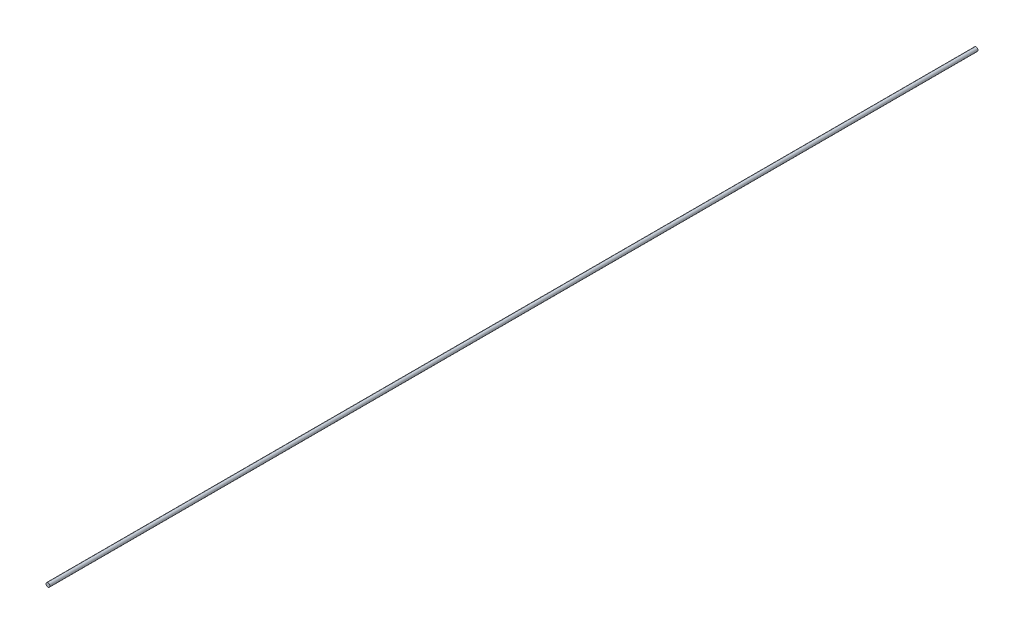
ISO-10303-21;
HEADER;
FILE_DESCRIPTION(('STEP AP214'),'2;1');
FILE_NAME('part.step','',(''),(''),'','','');
FILE_SCHEMA(('AUTOMOTIVE_DESIGN { 1 0 10303 214 1 1 1 1 }'));
ENDSEC;
DATA;
#1=APPLICATION_CONTEXT('core data for automotive mechanical design processes');
#2=APPLICATION_PROTOCOL_DEFINITION('international standard','automotive_design',2000,#1);
#3=PRODUCT_CONTEXT('',#1,'mechanical');
#4=PRODUCT('Part','Part','',(#3));
#5=PRODUCT_RELATED_PRODUCT_CATEGORY('part','',(#4));
#6=PRODUCT_DEFINITION_FORMATION('','',#4);
#7=PRODUCT_DEFINITION_CONTEXT('part definition',#1,'design');
#8=PRODUCT_DEFINITION('design','',#6,#7);
#9=PRODUCT_DEFINITION_SHAPE('','',#8);
#10=(LENGTH_UNIT() NAMED_UNIT(*) SI_UNIT(.MILLI.,.METRE.));
#11=(NAMED_UNIT(*) PLANE_ANGLE_UNIT() SI_UNIT($,.RADIAN.));
#12=(NAMED_UNIT(*) SI_UNIT($,.STERADIAN.) SOLID_ANGLE_UNIT());
#13=UNCERTAINTY_MEASURE_WITH_UNIT(LENGTH_MEASURE(1.E-05),#10,'distance_accuracy_value','');
#14=(GEOMETRIC_REPRESENTATION_CONTEXT(3) GLOBAL_UNCERTAINTY_ASSIGNED_CONTEXT((#13)) GLOBAL_UNIT_ASSIGNED_CONTEXT((#10,
#11,#12)) REPRESENTATION_CONTEXT('',''));
#15=CARTESIAN_POINT('',(0.,0.,0.));
#16=DIRECTION('',(0.,0.,1.));
#17=DIRECTION('',(1.,0.,0.));
#18=AXIS2_PLACEMENT_3D('',#15,#16,#17);
#19=CARTESIAN_POINT('',(-44.7215267955278,-1.87202950914363,766.489874060534));
#20=DIRECTION('',(0.,0.,-1.));
#21=DIRECTION('',(1.,0.,0.));
#22=AXIS2_PLACEMENT_3D('',#19,#20,#21);
#23=CYLINDRICAL_SURFACE('',#22,1.5875);
#24=CARTESIAN_POINT('',(-44.7215267955278,-1.87202950914363,761.999746));
#25=DIRECTION('',(0.,0.,1.));
#26=DIRECTION('',(1.,0.,0.));
#27=AXIS2_PLACEMENT_3D('',#24,#25,#26);
#28=CIRCLE('',#27,1.5875);
#29=CARTESIAN_POINT('',(-43.1340267955278,-1.87202950914363,761.999746));
#30=VERTEX_POINT('',#29);
#31=EDGE_CURVE('E10',#30,#30,#28,.F.);
#32=ORIENTED_EDGE('',*,*,#31,.T.);
#33=EDGE_LOOP('',(#32));
#34=FACE_BOUND('',#33,.T.);
#35=CARTESIAN_POINT('',(-44.7215267955278,-1.87202950914363,0.));
#36=DIRECTION('',(0.,0.,1.));
#37=DIRECTION('',(1.,0.,0.));
#38=AXIS2_PLACEMENT_3D('',#35,#36,#37);
#39=CIRCLE('',#38,1.5875);
#40=CARTESIAN_POINT('',(-43.1340267955278,-1.87202950914363,0.));
#41=VERTEX_POINT('',#40);
#42=EDGE_CURVE('E42',#41,#41,#39,.T.);
#43=ORIENTED_EDGE('',*,*,#42,.T.);
#44=EDGE_LOOP('',(#43));
#45=FACE_BOUND('',#44,.T.);
#46=ADVANCED_FACE('F35',(#34,#45),#23,.T.);
#47=CARTESIAN_POINT('',(-44.7215267955278,-1.87202950914363,0.));
#48=DIRECTION('',(0.,0.,-1.));
#49=DIRECTION('',(1.,0.,0.));
#50=AXIS2_PLACEMENT_3D('',#47,#48,#49);
#51=PLANE('',#50);
#52=ORIENTED_EDGE('',*,*,#42,.F.);
#53=EDGE_LOOP('',(#52));
#54=FACE_BOUND('',#53,.T.);
#55=ADVANCED_FACE('F49',(#54),#51,.T.);
#56=CARTESIAN_POINT('',(10.2783454417971,2.5845685138359,761.999746));
#57=DIRECTION('',(0.,0.,-1.));
#58=DIRECTION('',(1.,0.,0.));
#59=AXIS2_PLACEMENT_3D('',#56,#57,#58);
#60=PLANE('',#59);
#61=ORIENTED_EDGE('',*,*,#31,.F.);
#62=EDGE_LOOP('',(#61));
#63=FACE_BOUND('',#62,.T.);
#64=ADVANCED_FACE('F37',(#63),#60,.F.);
#65=CLOSED_SHELL('',(#46,#55,#64));
#66=MANIFOLD_SOLID_BREP('B2',#65);
#67=ADVANCED_BREP_SHAPE_REPRESENTATION('',(#18,#66),#14);
#68=SHAPE_DEFINITION_REPRESENTATION(#9,#67);
ENDSEC;
END-ISO-10303-21;
